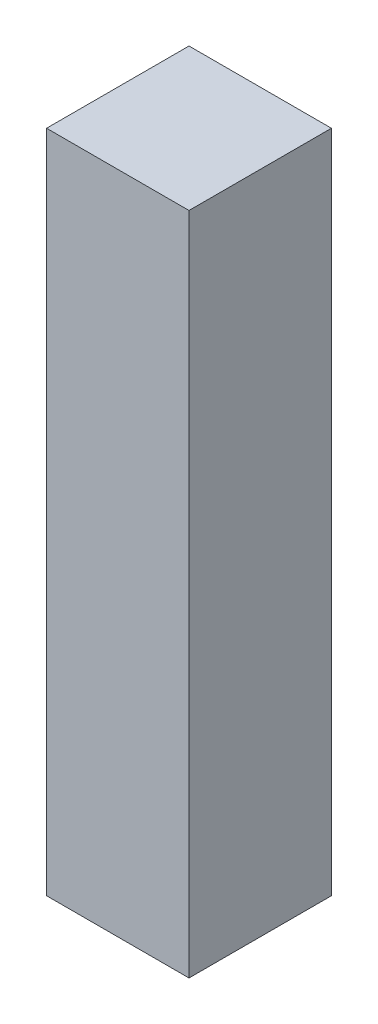
ISO-10303-21;
HEADER;
FILE_DESCRIPTION(('STEP AP214'),'2;1');
FILE_NAME('part.step','',(''),(''),'','','');
FILE_SCHEMA(('AUTOMOTIVE_DESIGN { 1 0 10303 214 1 1 1 1 }'));
ENDSEC;
DATA;
#1=APPLICATION_CONTEXT('core data for automotive mechanical design processes');
#2=APPLICATION_PROTOCOL_DEFINITION('international standard','automotive_design',2000,#1);
#3=PRODUCT_CONTEXT('',#1,'mechanical');
#4=PRODUCT('Part','Part','',(#3));
#5=PRODUCT_RELATED_PRODUCT_CATEGORY('part','',(#4));
#6=PRODUCT_DEFINITION_FORMATION('','',#4);
#7=PRODUCT_DEFINITION_CONTEXT('part definition',#1,'design');
#8=PRODUCT_DEFINITION('design','',#6,#7);
#9=PRODUCT_DEFINITION_SHAPE('','',#8);
#10=(LENGTH_UNIT() NAMED_UNIT(*) SI_UNIT(.MILLI.,.METRE.));
#11=(NAMED_UNIT(*) PLANE_ANGLE_UNIT() SI_UNIT($,.RADIAN.));
#12=(NAMED_UNIT(*) SI_UNIT($,.STERADIAN.) SOLID_ANGLE_UNIT());
#13=UNCERTAINTY_MEASURE_WITH_UNIT(LENGTH_MEASURE(1.E-05),#10,'distance_accuracy_value','');
#14=(GEOMETRIC_REPRESENTATION_CONTEXT(3) GLOBAL_UNCERTAINTY_ASSIGNED_CONTEXT((#13)) GLOBAL_UNIT_ASSIGNED_CONTEXT((#10,
#11,#12)) REPRESENTATION_CONTEXT('',''));
#15=CARTESIAN_POINT('',(0.,0.,0.));
#16=DIRECTION('',(0.,0.,1.));
#17=DIRECTION('',(1.,0.,0.));
#18=AXIS2_PLACEMENT_3D('',#15,#16,#17);
#19=CARTESIAN_POINT('',(-123.820754716981,700.,13.4433962264151));
#20=DIRECTION('',(1.,0.,0.));
#21=DIRECTION('',(0.,0.,-1.));
#22=AXIS2_PLACEMENT_3D('',#19,#20,#21);
#23=PLANE('',#22);
#24=DIRECTION('',(0.,0.,1.));
#25=VECTOR('',#24,1.);
#26=CARTESIAN_POINT('',(-123.820754716981,0.,13.4433962264151));
#27=LINE('',#26,#25);
#28=CARTESIAN_POINT('',(-123.820754716981,0.,13.4433962264151));
#29=VERTEX_POINT('',#28);
#30=CARTESIAN_POINT('',(-123.820754716981,0.,163.443396226415));
#31=VERTEX_POINT('',#30);
#32=EDGE_CURVE('E111',#29,#31,#27,.T.);
#33=ORIENTED_EDGE('',*,*,#32,.T.);
#34=DIRECTION('',(0.,-1.,0.));
#35=VECTOR('',#34,1.);
#36=CARTESIAN_POINT('',(-123.820754716981,700.,163.443396226415));
#37=LINE('',#36,#35);
#38=CARTESIAN_POINT('',(-123.820754716981,700.,163.443396226415));
#39=VERTEX_POINT('',#38);
#40=EDGE_CURVE('E11',#39,#31,#37,.T.);
#41=ORIENTED_EDGE('',*,*,#40,.F.);
#42=DIRECTION('',(0.,0.,1.));
#43=VECTOR('',#42,1.);
#44=CARTESIAN_POINT('',(-123.820754716981,700.,13.4433962264151));
#45=LINE('',#44,#43);
#46=CARTESIAN_POINT('',(-123.820754716981,700.,13.4433962264151));
#47=VERTEX_POINT('',#46);
#48=EDGE_CURVE('E95',#47,#39,#45,.T.);
#49=ORIENTED_EDGE('',*,*,#48,.F.);
#50=DIRECTION('',(0.,-1.,0.));
#51=VECTOR('',#50,1.);
#52=CARTESIAN_POINT('',(-123.820754716981,700.,13.4433962264151));
#53=LINE('',#52,#51);
#54=EDGE_CURVE('E107',#47,#29,#53,.T.);
#55=ORIENTED_EDGE('',*,*,#54,.T.);
#56=EDGE_LOOP('',(#33,#41,#49,#55));
#57=FACE_BOUND('',#56,.T.);
#58=ADVANCED_FACE('F43',(#57),#23,.F.);
#59=CARTESIAN_POINT('',(-123.820754716981,700.,163.443396226415));
#60=DIRECTION('',(0.,0.,-1.));
#61=DIRECTION('',(-1.,0.,0.));
#62=AXIS2_PLACEMENT_3D('',#59,#60,#61);
#63=PLANE('',#62);
#64=DIRECTION('',(1.,0.,0.));
#65=VECTOR('',#64,1.);
#66=CARTESIAN_POINT('',(-123.820754716981,0.,163.443396226415));
#67=LINE('',#66,#65);
#68=CARTESIAN_POINT('',(26.1792452830189,0.,163.443396226415));
#69=VERTEX_POINT('',#68);
#70=EDGE_CURVE('E100',#31,#69,#67,.T.);
#71=ORIENTED_EDGE('',*,*,#70,.T.);
#72=DIRECTION('',(0.,-1.,0.));
#73=VECTOR('',#72,1.);
#74=CARTESIAN_POINT('',(26.1792452830189,700.,163.443396226415));
#75=LINE('',#74,#73);
#76=CARTESIAN_POINT('',(26.1792452830189,700.,163.443396226415));
#77=VERTEX_POINT('',#76);
#78=EDGE_CURVE('E52',#77,#69,#75,.T.);
#79=ORIENTED_EDGE('',*,*,#78,.F.);
#80=DIRECTION('',(1.,0.,0.));
#81=VECTOR('',#80,1.);
#82=CARTESIAN_POINT('',(-123.820754716981,700.,163.443396226415));
#83=LINE('',#82,#81);
#84=EDGE_CURVE('E90',#39,#77,#83,.T.);
#85=ORIENTED_EDGE('',*,*,#84,.F.);
#86=ORIENTED_EDGE('',*,*,#40,.T.);
#87=EDGE_LOOP('',(#71,#79,#85,#86));
#88=FACE_BOUND('',#87,.T.);
#89=ADVANCED_FACE('F99',(#88),#63,.F.);
#90=CARTESIAN_POINT('',(26.1792452830189,700.,13.4433962264151));
#91=DIRECTION('',(-1.,0.,0.));
#92=DIRECTION('',(0.,0.,1.));
#93=AXIS2_PLACEMENT_3D('',#90,#91,#92);
#94=PLANE('',#93);
#95=DIRECTION('',(0.,0.,-1.));
#96=VECTOR('',#95,1.);
#97=CARTESIAN_POINT('',(26.1792452830189,0.,13.4433962264151));
#98=LINE('',#97,#96);
#99=CARTESIAN_POINT('',(26.1792452830189,0.,13.4433962264151));
#100=VERTEX_POINT('',#99);
#101=EDGE_CURVE('E77',#69,#100,#98,.T.);
#102=ORIENTED_EDGE('',*,*,#101,.T.);
#103=DIRECTION('',(0.,-1.,0.));
#104=VECTOR('',#103,1.);
#105=CARTESIAN_POINT('',(26.1792452830189,700.,13.4433962264151));
#106=LINE('',#105,#104);
#107=CARTESIAN_POINT('',(26.1792452830189,700.,13.4433962264151));
#108=VERTEX_POINT('',#107);
#109=EDGE_CURVE('E102',#108,#100,#106,.T.);
#110=ORIENTED_EDGE('',*,*,#109,.F.);
#111=DIRECTION('',(0.,0.,-1.));
#112=VECTOR('',#111,1.);
#113=CARTESIAN_POINT('',(26.1792452830189,700.,13.4433962264151));
#114=LINE('',#113,#112);
#115=EDGE_CURVE('E93',#77,#108,#114,.T.);
#116=ORIENTED_EDGE('',*,*,#115,.F.);
#117=ORIENTED_EDGE('',*,*,#78,.T.);
#118=EDGE_LOOP('',(#102,#110,#116,#117));
#119=FACE_BOUND('',#118,.T.);
#120=ADVANCED_FACE('F103',(#119),#94,.F.);
#121=CARTESIAN_POINT('',(-123.820754716981,700.,13.4433962264151));
#122=DIRECTION('',(0.,0.,1.));
#123=DIRECTION('',(1.,0.,0.));
#124=AXIS2_PLACEMENT_3D('',#121,#122,#123);
#125=PLANE('',#124);
#126=DIRECTION('',(-1.,0.,0.));
#127=VECTOR('',#126,1.);
#128=CARTESIAN_POINT('',(-123.820754716981,0.,13.4433962264151));
#129=LINE('',#128,#127);
#130=EDGE_CURVE('E83',#100,#29,#129,.T.);
#131=ORIENTED_EDGE('',*,*,#130,.T.);
#132=ORIENTED_EDGE('',*,*,#54,.F.);
#133=DIRECTION('',(-1.,0.,0.));
#134=VECTOR('',#133,1.);
#135=CARTESIAN_POINT('',(-123.820754716981,700.,13.4433962264151));
#136=LINE('',#135,#134);
#137=EDGE_CURVE('E60',#108,#47,#136,.T.);
#138=ORIENTED_EDGE('',*,*,#137,.F.);
#139=ORIENTED_EDGE('',*,*,#109,.T.);
#140=EDGE_LOOP('',(#131,#132,#138,#139));
#141=FACE_BOUND('',#140,.T.);
#142=ADVANCED_FACE('F124',(#141),#125,.F.);
#143=CARTESIAN_POINT('',(0.,700.,0.));
#144=DIRECTION('',(0.,1.,0.));
#145=DIRECTION('',(0.,0.,1.));
#146=AXIS2_PLACEMENT_3D('',#143,#144,#145);
#147=PLANE('',#146);
#148=ORIENTED_EDGE('',*,*,#48,.T.);
#149=ORIENTED_EDGE('',*,*,#84,.T.);
#150=ORIENTED_EDGE('',*,*,#115,.T.);
#151=ORIENTED_EDGE('',*,*,#137,.T.);
#152=EDGE_LOOP('',(#148,#149,#150,#151));
#153=FACE_BOUND('',#152,.T.);
#154=ADVANCED_FACE('F91',(#153),#147,.T.);
#155=CARTESIAN_POINT('',(0.,0.,0.));
#156=DIRECTION('',(0.,1.,0.));
#157=DIRECTION('',(0.,0.,1.));
#158=AXIS2_PLACEMENT_3D('',#155,#156,#157);
#159=PLANE('',#158);
#160=ORIENTED_EDGE('',*,*,#32,.F.);
#161=ORIENTED_EDGE('',*,*,#130,.F.);
#162=ORIENTED_EDGE('',*,*,#101,.F.);
#163=ORIENTED_EDGE('',*,*,#70,.F.);
#164=EDGE_LOOP('',(#160,#161,#162,#163));
#165=FACE_BOUND('',#164,.T.);
#166=ADVANCED_FACE('F127',(#165),#159,.F.);
#167=CLOSED_SHELL('',(#58,#89,#120,#142,#154,#166));
#168=MANIFOLD_SOLID_BREP('B2',#167);
#169=ADVANCED_BREP_SHAPE_REPRESENTATION('',(#18,#168),#14);
#170=SHAPE_DEFINITION_REPRESENTATION(#9,#169);
ENDSEC;
END-ISO-10303-21;
